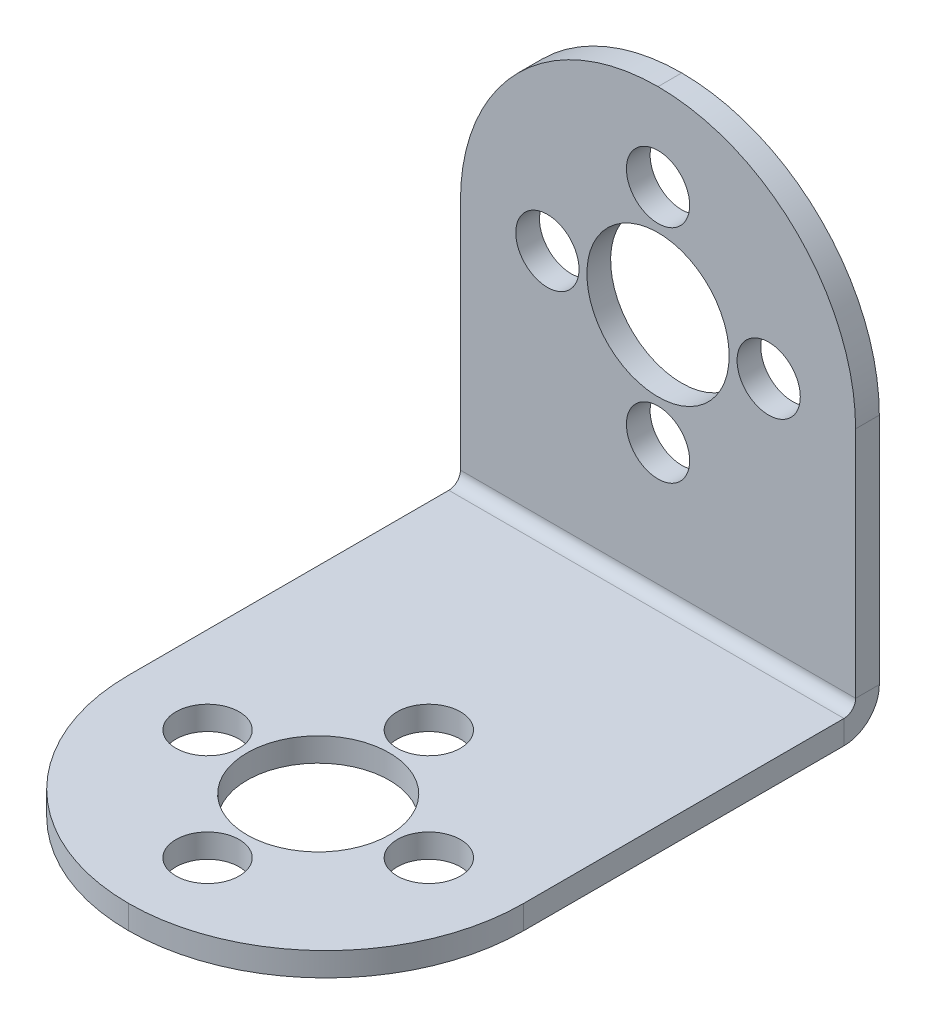
ISO-10303-21;
HEADER;
FILE_DESCRIPTION(('STEP AP214'),'2;1');
FILE_NAME('part.step','',(''),(''),'','','');
FILE_SCHEMA(('AUTOMOTIVE_DESIGN { 1 0 10303 214 1 1 1 1 }'));
ENDSEC;
DATA;
#1=APPLICATION_CONTEXT('core data for automotive mechanical design processes');
#2=APPLICATION_PROTOCOL_DEFINITION('international standard','automotive_design',2000,#1);
#3=PRODUCT_CONTEXT('',#1,'mechanical');
#4=PRODUCT('Part','Part','',(#3));
#5=PRODUCT_RELATED_PRODUCT_CATEGORY('part','',(#4));
#6=PRODUCT_DEFINITION_FORMATION('','',#4);
#7=PRODUCT_DEFINITION_CONTEXT('part definition',#1,'design');
#8=PRODUCT_DEFINITION('design','',#6,#7);
#9=PRODUCT_DEFINITION_SHAPE('','',#8);
#10=(LENGTH_UNIT() NAMED_UNIT(*) SI_UNIT(.MILLI.,.METRE.));
#11=(NAMED_UNIT(*) PLANE_ANGLE_UNIT() SI_UNIT($,.RADIAN.));
#12=(NAMED_UNIT(*) SI_UNIT($,.STERADIAN.) SOLID_ANGLE_UNIT());
#13=UNCERTAINTY_MEASURE_WITH_UNIT(LENGTH_MEASURE(1.E-05),#10,'distance_accuracy_value','');
#14=(GEOMETRIC_REPRESENTATION_CONTEXT(3) GLOBAL_UNCERTAINTY_ASSIGNED_CONTEXT((#13)) GLOBAL_UNIT_ASSIGNED_CONTEXT((#10,
#11,#12)) REPRESENTATION_CONTEXT('',''));
#15=CARTESIAN_POINT('',(0.,0.,0.));
#16=DIRECTION('',(0.,0.,1.));
#17=DIRECTION('',(1.,0.,0.));
#18=AXIS2_PLACEMENT_3D('',#15,#16,#17);
#19=CARTESIAN_POINT('',(0.,1.5,0.));
#20=DIRECTION('',(0.,1.,0.));
#21=DIRECTION('',(0.,0.,1.));
#22=AXIS2_PLACEMENT_3D('',#19,#20,#21);
#23=PLANE('',#22);
#24=CARTESIAN_POINT('',(7.,1.5,5.5));
#25=DIRECTION('',(0.,1.,0.));
#26=DIRECTION('',(0.,0.,1.));
#27=AXIS2_PLACEMENT_3D('',#24,#25,#26);
#28=CIRCLE('',#27,2.);
#29=CARTESIAN_POINT('',(7.,1.5,7.5));
#30=VERTEX_POINT('',#29);
#31=EDGE_CURVE('E203',#30,#30,#28,.T.);
#32=ORIENTED_EDGE('',*,*,#31,.F.);
#33=EDGE_LOOP('',(#32));
#34=FACE_BOUND('',#33,.T.);
#35=CARTESIAN_POINT('',(-7.,1.5,5.5));
#36=DIRECTION('',(0.,1.,0.));
#37=DIRECTION('',(0.,0.,1.));
#38=AXIS2_PLACEMENT_3D('',#35,#36,#37);
#39=CIRCLE('',#38,2.);
#40=CARTESIAN_POINT('',(-7.,1.5,7.5));
#41=VERTEX_POINT('',#40);
#42=EDGE_CURVE('E215',#41,#41,#39,.T.);
#43=ORIENTED_EDGE('',*,*,#42,.F.);
#44=EDGE_LOOP('',(#43));
#45=FACE_BOUND('',#44,.T.);
#46=CARTESIAN_POINT('',(0.,1.5,5.5));
#47=DIRECTION('',(0.,1.,0.));
#48=DIRECTION('',(0.,0.,1.));
#49=AXIS2_PLACEMENT_3D('',#46,#47,#48);
#50=CIRCLE('',#49,4.5);
#51=CARTESIAN_POINT('',(0.,1.5,10.));
#52=VERTEX_POINT('',#51);
#53=EDGE_CURVE('E221',#52,#52,#50,.T.);
#54=ORIENTED_EDGE('',*,*,#53,.F.);
#55=EDGE_LOOP('',(#54));
#56=FACE_BOUND('',#55,.T.);
#57=CARTESIAN_POINT('',(0.,1.5,12.5));
#58=DIRECTION('',(0.,1.,0.));
#59=DIRECTION('',(0.,0.,1.));
#60=AXIS2_PLACEMENT_3D('',#57,#58,#59);
#61=CIRCLE('',#60,2.);
#62=CARTESIAN_POINT('',(0.,1.5,14.5));
#63=VERTEX_POINT('',#62);
#64=EDGE_CURVE('E209',#63,#63,#61,.T.);
#65=ORIENTED_EDGE('',*,*,#64,.F.);
#66=EDGE_LOOP('',(#65));
#67=FACE_BOUND('',#66,.T.);
#68=CARTESIAN_POINT('',(0.,1.5,-1.5));
#69=DIRECTION('',(0.,1.,0.));
#70=DIRECTION('',(0.,0.,1.));
#71=AXIS2_PLACEMENT_3D('',#68,#69,#70);
#72=CIRCLE('',#71,2.);
#73=CARTESIAN_POINT('',(0.,1.5,0.500000000000001));
#74=VERTEX_POINT('',#73);
#75=EDGE_CURVE('E197',#74,#74,#72,.T.);
#76=ORIENTED_EDGE('',*,*,#75,.F.);
#77=EDGE_LOOP('',(#76));
#78=FACE_BOUND('',#77,.T.);
#79=CARTESIAN_POINT('',(0.,1.5,5.));
#80=DIRECTION('',(0.,1.,0.));
#81=DIRECTION('',(0.,0.,1.));
#82=AXIS2_PLACEMENT_3D('',#79,#80,#81);
#83=CIRCLE('',#82,12.5);
#84=CARTESIAN_POINT('',(-12.5,1.5,5.));
#85=VERTEX_POINT('',#84);
#86=CARTESIAN_POINT('',(0.,1.5,17.5));
#87=VERTEX_POINT('',#86);
#88=EDGE_CURVE('E243',#85,#87,#83,.T.);
#89=ORIENTED_EDGE('',*,*,#88,.T.);
#90=CARTESIAN_POINT('',(0.,1.5,5.));
#91=DIRECTION('',(0.,1.,0.));
#92=DIRECTION('',(0.,0.,1.));
#93=AXIS2_PLACEMENT_3D('',#90,#91,#92);
#94=CIRCLE('',#93,12.5);
#95=CARTESIAN_POINT('',(12.5,1.5,5.));
#96=VERTEX_POINT('',#95);
#97=EDGE_CURVE('E245',#87,#96,#94,.T.);
#98=ORIENTED_EDGE('',*,*,#97,.T.);
#99=DIRECTION('',(0.,0.,-1.));
#100=VECTOR('',#99,1.);
#101=CARTESIAN_POINT('',(12.5,1.5,-17.5));
#102=LINE('',#101,#100);
#103=CARTESIAN_POINT('',(12.5,1.5,-15.2634));
#104=VERTEX_POINT('',#103);
#105=EDGE_CURVE('E227',#96,#104,#102,.T.);
#106=ORIENTED_EDGE('',*,*,#105,.T.);
#107=DIRECTION('',(-1.,0.,0.));
#108=VECTOR('',#107,1.);
#109=CARTESIAN_POINT('',(-12.5,1.49999999999999,-15.2634));
#110=LINE('',#109,#108);
#111=CARTESIAN_POINT('',(-12.5,1.49999999999999,-15.2634));
#112=VERTEX_POINT('',#111);
#113=EDGE_CURVE('E169',#112,#104,#110,.F.);
#114=ORIENTED_EDGE('',*,*,#113,.F.);
#115=DIRECTION('',(0.,0.,1.));
#116=VECTOR('',#115,1.);
#117=CARTESIAN_POINT('',(-12.5,1.5,-17.5));
#118=LINE('',#117,#116);
#119=EDGE_CURVE('E229',#112,#85,#118,.T.);
#120=ORIENTED_EDGE('',*,*,#119,.T.);
#121=EDGE_LOOP('',(#89,#98,#106,#114,#120));
#122=FACE_BOUND('',#121,.T.);
#123=ADVANCED_FACE('F59',(#34,#45,#56,#67,#78,#122),#23,.T.);
#124=CARTESIAN_POINT('',(0.,0.,0.));
#125=DIRECTION('',(0.,1.,0.));
#126=DIRECTION('',(0.,0.,1.));
#127=AXIS2_PLACEMENT_3D('',#124,#125,#126);
#128=PLANE('',#127);
#129=CARTESIAN_POINT('',(0.,0.,-1.5));
#130=DIRECTION('',(0.,1.,0.));
#131=DIRECTION('',(0.,0.,1.));
#132=AXIS2_PLACEMENT_3D('',#129,#130,#131);
#133=CIRCLE('',#132,2.);
#134=CARTESIAN_POINT('',(0.,0.,0.500000000000001));
#135=VERTEX_POINT('',#134);
#136=EDGE_CURVE('E194',#135,#135,#133,.T.);
#137=ORIENTED_EDGE('',*,*,#136,.T.);
#138=EDGE_LOOP('',(#137));
#139=FACE_BOUND('',#138,.T.);
#140=CARTESIAN_POINT('',(7.,0.,5.5));
#141=DIRECTION('',(0.,1.,0.));
#142=DIRECTION('',(0.,0.,1.));
#143=AXIS2_PLACEMENT_3D('',#140,#141,#142);
#144=CIRCLE('',#143,2.);
#145=CARTESIAN_POINT('',(7.,0.,7.5));
#146=VERTEX_POINT('',#145);
#147=EDGE_CURVE('E200',#146,#146,#144,.T.);
#148=ORIENTED_EDGE('',*,*,#147,.T.);
#149=EDGE_LOOP('',(#148));
#150=FACE_BOUND('',#149,.T.);
#151=CARTESIAN_POINT('',(0.,0.,12.5));
#152=DIRECTION('',(0.,1.,0.));
#153=DIRECTION('',(0.,0.,1.));
#154=AXIS2_PLACEMENT_3D('',#151,#152,#153);
#155=CIRCLE('',#154,2.);
#156=CARTESIAN_POINT('',(0.,0.,14.5));
#157=VERTEX_POINT('',#156);
#158=EDGE_CURVE('E206',#157,#157,#155,.T.);
#159=ORIENTED_EDGE('',*,*,#158,.T.);
#160=EDGE_LOOP('',(#159));
#161=FACE_BOUND('',#160,.T.);
#162=CARTESIAN_POINT('',(-7.,0.,5.5));
#163=DIRECTION('',(0.,1.,0.));
#164=DIRECTION('',(0.,0.,1.));
#165=AXIS2_PLACEMENT_3D('',#162,#163,#164);
#166=CIRCLE('',#165,2.);
#167=CARTESIAN_POINT('',(-7.,0.,7.5));
#168=VERTEX_POINT('',#167);
#169=EDGE_CURVE('E212',#168,#168,#166,.T.);
#170=ORIENTED_EDGE('',*,*,#169,.T.);
#171=EDGE_LOOP('',(#170));
#172=FACE_BOUND('',#171,.T.);
#173=CARTESIAN_POINT('',(0.,0.,5.5));
#174=DIRECTION('',(0.,1.,0.));
#175=DIRECTION('',(0.,0.,1.));
#176=AXIS2_PLACEMENT_3D('',#173,#174,#175);
#177=CIRCLE('',#176,4.5);
#178=CARTESIAN_POINT('',(0.,0.,10.));
#179=VERTEX_POINT('',#178);
#180=EDGE_CURVE('E218',#179,#179,#177,.T.);
#181=ORIENTED_EDGE('',*,*,#180,.T.);
#182=EDGE_LOOP('',(#181));
#183=FACE_BOUND('',#182,.T.);
#184=DIRECTION('',(0.,0.,-1.));
#185=VECTOR('',#184,1.);
#186=CARTESIAN_POINT('',(12.5,0.,-17.5));
#187=LINE('',#186,#185);
#188=CARTESIAN_POINT('',(12.5,0.,5.));
#189=VERTEX_POINT('',#188);
#190=CARTESIAN_POINT('',(12.5,0.,-15.2634));
#191=VERTEX_POINT('',#190);
#192=EDGE_CURVE('E224',#189,#191,#187,.T.);
#193=ORIENTED_EDGE('',*,*,#192,.F.);
#194=CARTESIAN_POINT('',(0.,0.,5.));
#195=DIRECTION('',(0.,1.,0.));
#196=DIRECTION('',(0.,0.,1.));
#197=AXIS2_PLACEMENT_3D('',#194,#195,#196);
#198=CIRCLE('',#197,12.5);
#199=CARTESIAN_POINT('',(0.,0.,17.5));
#200=VERTEX_POINT('',#199);
#201=EDGE_CURVE('E241',#189,#200,#198,.F.);
#202=ORIENTED_EDGE('',*,*,#201,.T.);
#203=CARTESIAN_POINT('',(0.,0.,5.));
#204=DIRECTION('',(0.,1.,0.));
#205=DIRECTION('',(0.,0.,1.));
#206=AXIS2_PLACEMENT_3D('',#203,#204,#205);
#207=CIRCLE('',#206,12.5);
#208=CARTESIAN_POINT('',(-12.5,0.,5.));
#209=VERTEX_POINT('',#208);
#210=EDGE_CURVE('E239',#200,#209,#207,.F.);
#211=ORIENTED_EDGE('',*,*,#210,.T.);
#212=DIRECTION('',(0.,0.,1.));
#213=VECTOR('',#212,1.);
#214=CARTESIAN_POINT('',(-12.5,0.,-17.5));
#215=LINE('',#214,#213);
#216=CARTESIAN_POINT('',(-12.5,0.,-15.2634));
#217=VERTEX_POINT('',#216);
#218=EDGE_CURVE('E230',#217,#209,#215,.T.);
#219=ORIENTED_EDGE('',*,*,#218,.F.);
#220=DIRECTION('',(-1.,0.,0.));
#221=VECTOR('',#220,1.);
#222=CARTESIAN_POINT('',(-12.5,0.,-15.2634));
#223=LINE('',#222,#221);
#224=EDGE_CURVE('E147',#217,#191,#223,.F.);
#225=ORIENTED_EDGE('',*,*,#224,.T.);
#226=EDGE_LOOP('',(#193,#202,#211,#219,#225));
#227=FACE_BOUND('',#226,.T.);
#228=ADVANCED_FACE('F302',(#139,#150,#161,#172,#183,#227),#128,.F.);
#229=CARTESIAN_POINT('',(12.5,1.5,-17.5));
#230=DIRECTION('',(-1.,0.,0.));
#231=DIRECTION('',(0.,0.,1.));
#232=AXIS2_PLACEMENT_3D('',#229,#230,#231);
#233=PLANE('',#232);
#234=ORIENTED_EDGE('',*,*,#105,.F.);
#235=DIRECTION('',(0.,-1.,0.));
#236=VECTOR('',#235,1.);
#237=CARTESIAN_POINT('',(12.5,1.5,5.));
#238=LINE('',#237,#236);
#239=EDGE_CURVE('E233',#96,#189,#238,.T.);
#240=ORIENTED_EDGE('',*,*,#239,.T.);
#241=ORIENTED_EDGE('',*,*,#192,.T.);
#242=DIRECTION('',(0.,-1.,0.));
#243=VECTOR('',#242,1.);
#244=CARTESIAN_POINT('',(12.5,1.49999999999999,-15.2634));
#245=LINE('',#244,#243);
#246=EDGE_CURVE('E191',#104,#191,#245,.T.);
#247=ORIENTED_EDGE('',*,*,#246,.F.);
#248=EDGE_LOOP('',(#234,#240,#241,#247));
#249=FACE_BOUND('',#248,.T.);
#250=ADVANCED_FACE('F298',(#249),#233,.F.);
#251=CARTESIAN_POINT('',(-12.5,1.5,-17.5));
#252=DIRECTION('',(1.,0.,0.));
#253=DIRECTION('',(0.,0.,-1.));
#254=AXIS2_PLACEMENT_3D('',#251,#252,#253);
#255=PLANE('',#254);
#256=ORIENTED_EDGE('',*,*,#218,.T.);
#257=DIRECTION('',(0.,-1.,0.));
#258=VECTOR('',#257,1.);
#259=CARTESIAN_POINT('',(-12.5,1.5,5.));
#260=LINE('',#259,#258);
#261=EDGE_CURVE('E247',#209,#85,#260,.F.);
#262=ORIENTED_EDGE('',*,*,#261,.T.);
#263=ORIENTED_EDGE('',*,*,#119,.F.);
#264=DIRECTION('',(0.,-1.,0.));
#265=VECTOR('',#264,1.);
#266=CARTESIAN_POINT('',(-12.5,1.49999999999999,-15.2634));
#267=LINE('',#266,#265);
#268=EDGE_CURVE('E185',#112,#217,#267,.T.);
#269=ORIENTED_EDGE('',*,*,#268,.T.);
#270=EDGE_LOOP('',(#256,#262,#263,#269));
#271=FACE_BOUND('',#270,.T.);
#272=ADVANCED_FACE('F291',(#271),#255,.F.);
#273=CARTESIAN_POINT('',(0.,1.5,5.5));
#274=DIRECTION('',(0.,-1.,0.));
#275=DIRECTION('',(0.,0.,-1.));
#276=AXIS2_PLACEMENT_3D('',#273,#274,#275);
#277=CYLINDRICAL_SURFACE('',#276,4.5);
#278=ORIENTED_EDGE('',*,*,#53,.T.);
#279=EDGE_LOOP('',(#278));
#280=FACE_BOUND('',#279,.T.);
#281=ORIENTED_EDGE('',*,*,#180,.F.);
#282=EDGE_LOOP('',(#281));
#283=FACE_BOUND('',#282,.T.);
#284=ADVANCED_FACE('F317',(#280,#283),#277,.F.);
#285=CARTESIAN_POINT('',(-7.,1.5,5.5));
#286=DIRECTION('',(0.,-1.,0.));
#287=DIRECTION('',(0.,0.,-1.));
#288=AXIS2_PLACEMENT_3D('',#285,#286,#287);
#289=CYLINDRICAL_SURFACE('',#288,2.);
#290=ORIENTED_EDGE('',*,*,#42,.T.);
#291=EDGE_LOOP('',(#290));
#292=FACE_BOUND('',#291,.T.);
#293=ORIENTED_EDGE('',*,*,#169,.F.);
#294=EDGE_LOOP('',(#293));
#295=FACE_BOUND('',#294,.T.);
#296=ADVANCED_FACE('F451',(#292,#295),#289,.F.);
#297=CARTESIAN_POINT('',(0.,1.5,12.5));
#298=DIRECTION('',(0.,-1.,0.));
#299=DIRECTION('',(0.,0.,-1.));
#300=AXIS2_PLACEMENT_3D('',#297,#298,#299);
#301=CYLINDRICAL_SURFACE('',#300,2.);
#302=ORIENTED_EDGE('',*,*,#64,.T.);
#303=EDGE_LOOP('',(#302));
#304=FACE_BOUND('',#303,.T.);
#305=ORIENTED_EDGE('',*,*,#158,.F.);
#306=EDGE_LOOP('',(#305));
#307=FACE_BOUND('',#306,.T.);
#308=ADVANCED_FACE('F443',(#304,#307),#301,.F.);
#309=CARTESIAN_POINT('',(7.,1.5,5.5));
#310=DIRECTION('',(0.,-1.,0.));
#311=DIRECTION('',(0.,0.,-1.));
#312=AXIS2_PLACEMENT_3D('',#309,#310,#311);
#313=CYLINDRICAL_SURFACE('',#312,2.);
#314=ORIENTED_EDGE('',*,*,#31,.T.);
#315=EDGE_LOOP('',(#314));
#316=FACE_BOUND('',#315,.T.);
#317=ORIENTED_EDGE('',*,*,#147,.F.);
#318=EDGE_LOOP('',(#317));
#319=FACE_BOUND('',#318,.T.);
#320=ADVANCED_FACE('F435',(#316,#319),#313,.F.);
#321=CARTESIAN_POINT('',(0.,1.5,-1.5));
#322=DIRECTION('',(0.,-1.,0.));
#323=DIRECTION('',(0.,0.,-1.));
#324=AXIS2_PLACEMENT_3D('',#321,#322,#323);
#325=CYLINDRICAL_SURFACE('',#324,2.);
#326=ORIENTED_EDGE('',*,*,#75,.T.);
#327=EDGE_LOOP('',(#326));
#328=FACE_BOUND('',#327,.T.);
#329=ORIENTED_EDGE('',*,*,#136,.F.);
#330=EDGE_LOOP('',(#329));
#331=FACE_BOUND('',#330,.T.);
#332=ADVANCED_FACE('F428',(#328,#331),#325,.F.);
#333=CARTESIAN_POINT('',(12.5,2.23659999999999,-15.2634));
#334=DIRECTION('',(1.,0.,0.));
#335=DIRECTION('',(0.,0.,-1.));
#336=AXIS2_PLACEMENT_3D('',#333,#334,#335);
#337=PLANE('',#336);
#338=DIRECTION('',(0.,0.,1.));
#339=VECTOR('',#338,1.);
#340=CARTESIAN_POINT('',(12.5,2.23660000000001,-17.5));
#341=LINE('',#340,#339);
#342=CARTESIAN_POINT('',(12.5,2.23659999999999,-16.));
#343=VERTEX_POINT('',#342);
#344=CARTESIAN_POINT('',(12.5,2.23659999999999,-17.5));
#345=VERTEX_POINT('',#344);
#346=EDGE_CURVE('E180',#343,#345,#341,.F.);
#347=ORIENTED_EDGE('',*,*,#346,.F.);
#348=CARTESIAN_POINT('',(12.5,2.23659999999999,-15.2634));
#349=DIRECTION('',(-1.,0.,0.));
#350=DIRECTION('',(0.,0.,1.));
#351=AXIS2_PLACEMENT_3D('',#348,#349,#350);
#352=CIRCLE('',#351,0.7366);
#353=EDGE_CURVE('E150',#104,#343,#352,.F.);
#354=ORIENTED_EDGE('',*,*,#353,.F.);
#355=ORIENTED_EDGE('',*,*,#246,.T.);
#356=CARTESIAN_POINT('',(12.5,2.23659999999999,-15.2634));
#357=DIRECTION('',(-1.,0.,0.));
#358=DIRECTION('',(0.,0.,1.));
#359=AXIS2_PLACEMENT_3D('',#356,#357,#358);
#360=CIRCLE('',#359,2.2366);
#361=EDGE_CURVE('E184',#191,#345,#360,.F.);
#362=ORIENTED_EDGE('',*,*,#361,.T.);
#363=EDGE_LOOP('',(#347,#354,#355,#362));
#364=FACE_BOUND('',#363,.T.);
#365=ADVANCED_FACE('F282',(#364),#337,.T.);
#366=CARTESIAN_POINT('',(-12.5,2.23659999999999,-15.2634));
#367=DIRECTION('',(1.,0.,0.));
#368=DIRECTION('',(0.,0.,-1.));
#369=AXIS2_PLACEMENT_3D('',#366,#367,#368);
#370=PLANE('',#369);
#371=CARTESIAN_POINT('',(-12.5,2.23659999999999,-15.2634));
#372=DIRECTION('',(-1.,0.,0.));
#373=DIRECTION('',(0.,0.,1.));
#374=AXIS2_PLACEMENT_3D('',#371,#372,#373);
#375=CIRCLE('',#374,0.7366);
#376=CARTESIAN_POINT('',(-12.5,2.23659999999999,-16.));
#377=VERTEX_POINT('',#376);
#378=EDGE_CURVE('E157',#377,#112,#375,.T.);
#379=ORIENTED_EDGE('',*,*,#378,.F.);
#380=DIRECTION('',(0.,0.,1.));
#381=VECTOR('',#380,1.);
#382=CARTESIAN_POINT('',(-12.5,2.2366,-16.));
#383=LINE('',#382,#381);
#384=CARTESIAN_POINT('',(-12.5,2.23660000000001,-17.5));
#385=VERTEX_POINT('',#384);
#386=EDGE_CURVE('E154',#377,#385,#383,.F.);
#387=ORIENTED_EDGE('',*,*,#386,.T.);
#388=CARTESIAN_POINT('',(-12.5,2.23659999999999,-15.2634));
#389=DIRECTION('',(-1.,0.,0.));
#390=DIRECTION('',(0.,0.,1.));
#391=AXIS2_PLACEMENT_3D('',#388,#389,#390);
#392=CIRCLE('',#391,2.2366);
#393=EDGE_CURVE('E139',#385,#217,#392,.T.);
#394=ORIENTED_EDGE('',*,*,#393,.T.);
#395=ORIENTED_EDGE('',*,*,#268,.F.);
#396=EDGE_LOOP('',(#379,#387,#394,#395));
#397=FACE_BOUND('',#396,.T.);
#398=ADVANCED_FACE('F155',(#397),#370,.F.);
#399=CARTESIAN_POINT('',(-12.5,2.23659999999999,-15.2634));
#400=DIRECTION('',(-1.,0.,0.));
#401=DIRECTION('',(0.,0.,-1.));
#402=AXIS2_PLACEMENT_3D('',#399,#400,#401);
#403=CYLINDRICAL_SURFACE('',#402,2.2366);
#404=ORIENTED_EDGE('',*,*,#224,.F.);
#405=ORIENTED_EDGE('',*,*,#393,.F.);
#406=DIRECTION('',(-1.,0.,0.));
#407=VECTOR('',#406,1.);
#408=CARTESIAN_POINT('',(12.5,2.23660000000001,-17.5));
#409=LINE('',#408,#407);
#410=EDGE_CURVE('E144',#385,#345,#409,.F.);
#411=ORIENTED_EDGE('',*,*,#410,.T.);
#412=ORIENTED_EDGE('',*,*,#361,.F.);
#413=EDGE_LOOP('',(#404,#405,#411,#412));
#414=FACE_BOUND('',#413,.T.);
#415=ADVANCED_FACE('F141',(#414),#403,.T.);
#416=CARTESIAN_POINT('',(-12.5,2.23659999999999,-15.2634));
#417=DIRECTION('',(-1.,0.,0.));
#418=DIRECTION('',(0.,0.,-1.));
#419=AXIS2_PLACEMENT_3D('',#416,#417,#418);
#420=CYLINDRICAL_SURFACE('',#419,0.7366);
#421=ORIENTED_EDGE('',*,*,#113,.T.);
#422=ORIENTED_EDGE('',*,*,#353,.T.);
#423=DIRECTION('',(-1.,0.,0.));
#424=VECTOR('',#423,1.);
#425=CARTESIAN_POINT('',(12.5,2.2366,-16.));
#426=LINE('',#425,#424);
#427=EDGE_CURVE('E159',#343,#377,#426,.T.);
#428=ORIENTED_EDGE('',*,*,#427,.T.);
#429=ORIENTED_EDGE('',*,*,#378,.T.);
#430=EDGE_LOOP('',(#421,#422,#428,#429));
#431=FACE_BOUND('',#430,.T.);
#432=ADVANCED_FACE('F284',(#431),#420,.F.);
#433=CARTESIAN_POINT('',(12.5,1.49999999999999,-17.5));
#434=DIRECTION('',(-1.,0.,0.));
#435=DIRECTION('',(0.,0.,1.));
#436=AXIS2_PLACEMENT_3D('',#433,#434,#435);
#437=PLANE('',#436);
#438=DIRECTION('',(0.,-1.,0.));
#439=VECTOR('',#438,1.);
#440=CARTESIAN_POINT('',(12.5,0.,-17.5));
#441=LINE('',#440,#439);
#442=CARTESIAN_POINT('',(12.5,17.,-17.5000000000001));
#443=VERTEX_POINT('',#442);
#444=EDGE_CURVE('E164',#443,#345,#441,.T.);
#445=ORIENTED_EDGE('',*,*,#444,.F.);
#446=DIRECTION('',(0.,0.,1.));
#447=VECTOR('',#446,1.);
#448=CARTESIAN_POINT('',(12.5,17.,-17.5000000000001));
#449=LINE('',#448,#447);
#450=CARTESIAN_POINT('',(12.5,17.,-16.0000000000001));
#451=VERTEX_POINT('',#450);
#452=EDGE_CURVE('E249',#443,#451,#449,.T.);
#453=ORIENTED_EDGE('',*,*,#452,.T.);
#454=DIRECTION('',(0.,1.,0.));
#455=VECTOR('',#454,1.);
#456=CARTESIAN_POINT('',(12.5,1.5,-16.));
#457=LINE('',#456,#455);
#458=EDGE_CURVE('E165',#451,#343,#457,.F.);
#459=ORIENTED_EDGE('',*,*,#458,.T.);
#460=ORIENTED_EDGE('',*,*,#346,.T.);
#461=EDGE_LOOP('',(#445,#453,#459,#460));
#462=FACE_BOUND('',#461,.T.);
#463=ADVANCED_FACE('F279',(#462),#437,.F.);
#464=CARTESIAN_POINT('',(-12.5,29.5,-17.5000000000001));
#465=DIRECTION('',(1.,0.,0.));
#466=DIRECTION('',(0.,1.,0.));
#467=AXIS2_PLACEMENT_3D('',#464,#465,#466);
#468=PLANE('',#467);
#469=DIRECTION('',(0.,-1.,0.));
#470=VECTOR('',#469,1.);
#471=CARTESIAN_POINT('',(-12.5,29.5,-16.0000000000001));
#472=LINE('',#471,#470);
#473=CARTESIAN_POINT('',(-12.5,17.,-16.0000000000001));
#474=VERTEX_POINT('',#473);
#475=EDGE_CURVE('E171',#377,#474,#472,.F.);
#476=ORIENTED_EDGE('',*,*,#475,.T.);
#477=DIRECTION('',(0.,0.,1.));
#478=VECTOR('',#477,1.);
#479=CARTESIAN_POINT('',(-12.5,17.,-17.5000000000001));
#480=LINE('',#479,#478);
#481=CARTESIAN_POINT('',(-12.5,17.,-17.5000000000001));
#482=VERTEX_POINT('',#481);
#483=EDGE_CURVE('E13',#474,#482,#480,.F.);
#484=ORIENTED_EDGE('',*,*,#483,.T.);
#485=DIRECTION('',(0.,1.,0.));
#486=VECTOR('',#485,1.);
#487=CARTESIAN_POINT('',(-12.5,0.,-17.5));
#488=LINE('',#487,#486);
#489=EDGE_CURVE('E162',#385,#482,#488,.T.);
#490=ORIENTED_EDGE('',*,*,#489,.F.);
#491=ORIENTED_EDGE('',*,*,#386,.F.);
#492=EDGE_LOOP('',(#476,#484,#490,#491));
#493=FACE_BOUND('',#492,.T.);
#494=ADVANCED_FACE('F167',(#493),#468,.F.);
#495=CARTESIAN_POINT('',(0.,0.,-17.5));
#496=DIRECTION('',(0.,0.,1.));
#497=DIRECTION('',(0.,-1.,0.));
#498=AXIS2_PLACEMENT_3D('',#495,#496,#497);
#499=PLANE('',#498);
#500=CARTESIAN_POINT('',(-7.,17.,-17.5000000000001));
#501=DIRECTION('',(0.,0.,1.));
#502=DIRECTION('',(0.,-1.,0.));
#503=AXIS2_PLACEMENT_3D('',#500,#501,#502);
#504=CIRCLE('',#503,2.);
#505=CARTESIAN_POINT('',(-7.,15.,-17.5));
#506=VERTEX_POINT('',#505);
#507=EDGE_CURVE('E174',#506,#506,#504,.T.);
#508=ORIENTED_EDGE('',*,*,#507,.T.);
#509=EDGE_LOOP('',(#508));
#510=FACE_BOUND('',#509,.T.);
#511=CARTESIAN_POINT('',(7.,17.,-17.5000000000001));
#512=DIRECTION('',(0.,0.,1.));
#513=DIRECTION('',(0.,-1.,0.));
#514=AXIS2_PLACEMENT_3D('',#511,#512,#513);
#515=CIRCLE('',#514,2.);
#516=CARTESIAN_POINT('',(7.,15.,-17.5));
#517=VERTEX_POINT('',#516);
#518=EDGE_CURVE('E606',#517,#517,#515,.T.);
#519=ORIENTED_EDGE('',*,*,#518,.T.);
#520=EDGE_LOOP('',(#519));
#521=FACE_BOUND('',#520,.T.);
#522=CARTESIAN_POINT('',(0.,24.,-17.5000000000001));
#523=DIRECTION('',(0.,0.,1.));
#524=DIRECTION('',(0.,-1.,0.));
#525=AXIS2_PLACEMENT_3D('',#522,#523,#524);
#526=CIRCLE('',#525,2.);
#527=CARTESIAN_POINT('',(0.,22.,-17.5000000000001));
#528=VERTEX_POINT('',#527);
#529=EDGE_CURVE('E610',#528,#528,#526,.T.);
#530=ORIENTED_EDGE('',*,*,#529,.T.);
#531=EDGE_LOOP('',(#530));
#532=FACE_BOUND('',#531,.T.);
#533=CARTESIAN_POINT('',(0.,10.,-17.5));
#534=DIRECTION('',(0.,0.,1.));
#535=DIRECTION('',(0.,-1.,0.));
#536=AXIS2_PLACEMENT_3D('',#533,#534,#535);
#537=CIRCLE('',#536,2.);
#538=CARTESIAN_POINT('',(0.,8.,-17.5));
#539=VERTEX_POINT('',#538);
#540=EDGE_CURVE('E614',#539,#539,#537,.T.);
#541=ORIENTED_EDGE('',*,*,#540,.T.);
#542=EDGE_LOOP('',(#541));
#543=FACE_BOUND('',#542,.T.);
#544=CARTESIAN_POINT('',(0.,17.,-17.5000000000001));
#545=DIRECTION('',(0.,0.,1.));
#546=DIRECTION('',(0.,-1.,0.));
#547=AXIS2_PLACEMENT_3D('',#544,#545,#546);
#548=CIRCLE('',#547,4.5);
#549=CARTESIAN_POINT('',(0.,12.5,-17.5));
#550=VERTEX_POINT('',#549);
#551=EDGE_CURVE('E617',#550,#550,#548,.T.);
#552=ORIENTED_EDGE('',*,*,#551,.T.);
#553=EDGE_LOOP('',(#552));
#554=FACE_BOUND('',#553,.T.);
#555=CARTESIAN_POINT('',(0.,17.,-17.5000000000001));
#556=DIRECTION('',(0.,0.,1.));
#557=DIRECTION('',(0.,-1.,0.));
#558=AXIS2_PLACEMENT_3D('',#555,#556,#557);
#559=CIRCLE('',#558,12.5);
#560=CARTESIAN_POINT('',(0.,29.5,-17.5000000000001));
#561=VERTEX_POINT('',#560);
#562=EDGE_CURVE('E76',#482,#561,#559,.F.);
#563=ORIENTED_EDGE('',*,*,#562,.T.);
#564=CARTESIAN_POINT('',(0.,17.,-17.5000000000001));
#565=DIRECTION('',(0.,0.,1.));
#566=DIRECTION('',(0.,-1.,0.));
#567=AXIS2_PLACEMENT_3D('',#564,#565,#566);
#568=CIRCLE('',#567,12.5);
#569=EDGE_CURVE('E68',#561,#443,#568,.F.);
#570=ORIENTED_EDGE('',*,*,#569,.T.);
#571=ORIENTED_EDGE('',*,*,#444,.T.);
#572=ORIENTED_EDGE('',*,*,#410,.F.);
#573=ORIENTED_EDGE('',*,*,#489,.T.);
#574=EDGE_LOOP('',(#563,#570,#571,#572,#573));
#575=FACE_BOUND('',#574,.T.);
#576=ADVANCED_FACE('F161',(#510,#521,#532,#543,#554,#575),#499,.F.);
#577=CARTESIAN_POINT('',(0.,0.,-16.));
#578=DIRECTION('',(0.,0.,1.));
#579=DIRECTION('',(0.,-1.,0.));
#580=AXIS2_PLACEMENT_3D('',#577,#578,#579);
#581=PLANE('',#580);
#582=CARTESIAN_POINT('',(-7.,17.,-16.));
#583=DIRECTION('',(0.,0.,1.));
#584=DIRECTION('',(1.,0.,0.));
#585=AXIS2_PLACEMENT_3D('',#582,#583,#584);
#586=CIRCLE('',#585,2.);
#587=CARTESIAN_POINT('',(-5.,17.,-16.));
#588=VERTEX_POINT('',#587);
#589=EDGE_CURVE('E623',#588,#588,#586,.T.);
#590=ORIENTED_EDGE('',*,*,#589,.F.);
#591=EDGE_LOOP('',(#590));
#592=FACE_BOUND('',#591,.T.);
#593=CARTESIAN_POINT('',(7.,17.,-16.));
#594=DIRECTION('',(0.,0.,1.));
#595=DIRECTION('',(1.,0.,0.));
#596=AXIS2_PLACEMENT_3D('',#593,#594,#595);
#597=CIRCLE('',#596,2.);
#598=CARTESIAN_POINT('',(9.,17.,-16.));
#599=VERTEX_POINT('',#598);
#600=EDGE_CURVE('E627',#599,#599,#597,.T.);
#601=ORIENTED_EDGE('',*,*,#600,.F.);
#602=EDGE_LOOP('',(#601));
#603=FACE_BOUND('',#602,.T.);
#604=CARTESIAN_POINT('',(0.,24.,-16.));
#605=DIRECTION('',(0.,0.,1.));
#606=DIRECTION('',(1.,0.,0.));
#607=AXIS2_PLACEMENT_3D('',#604,#605,#606);
#608=CIRCLE('',#607,2.);
#609=CARTESIAN_POINT('',(2.,24.,-16.));
#610=VERTEX_POINT('',#609);
#611=EDGE_CURVE('E264',#610,#610,#608,.T.);
#612=ORIENTED_EDGE('',*,*,#611,.F.);
#613=EDGE_LOOP('',(#612));
#614=FACE_BOUND('',#613,.T.);
#615=CARTESIAN_POINT('',(0.,10.,-16.));
#616=DIRECTION('',(0.,0.,1.));
#617=DIRECTION('',(1.,0.,0.));
#618=AXIS2_PLACEMENT_3D('',#615,#616,#617);
#619=CIRCLE('',#618,2.);
#620=CARTESIAN_POINT('',(2.,10.,-16.));
#621=VERTEX_POINT('',#620);
#622=EDGE_CURVE('E259',#621,#621,#619,.T.);
#623=ORIENTED_EDGE('',*,*,#622,.F.);
#624=EDGE_LOOP('',(#623));
#625=FACE_BOUND('',#624,.T.);
#626=CARTESIAN_POINT('',(0.,17.,-16.));
#627=DIRECTION('',(0.,0.,1.));
#628=DIRECTION('',(1.,0.,0.));
#629=AXIS2_PLACEMENT_3D('',#626,#627,#628);
#630=CIRCLE('',#629,4.5);
#631=CARTESIAN_POINT('',(4.5,17.,-16.));
#632=VERTEX_POINT('',#631);
#633=EDGE_CURVE('E619',#632,#632,#630,.T.);
#634=ORIENTED_EDGE('',*,*,#633,.F.);
#635=EDGE_LOOP('',(#634));
#636=FACE_BOUND('',#635,.T.);
#637=ORIENTED_EDGE('',*,*,#458,.F.);
#638=CARTESIAN_POINT('',(0.,17.,-16.0000000000001));
#639=DIRECTION('',(0.,0.,1.));
#640=DIRECTION('',(0.,-1.,0.));
#641=AXIS2_PLACEMENT_3D('',#638,#639,#640);
#642=CIRCLE('',#641,12.5);
#643=CARTESIAN_POINT('',(0.,29.5,-16.0000000000001));
#644=VERTEX_POINT('',#643);
#645=EDGE_CURVE('E254',#451,#644,#642,.T.);
#646=ORIENTED_EDGE('',*,*,#645,.T.);
#647=CARTESIAN_POINT('',(0.,17.,-16.0000000000001));
#648=DIRECTION('',(0.,0.,1.));
#649=DIRECTION('',(0.,-1.,0.));
#650=AXIS2_PLACEMENT_3D('',#647,#648,#649);
#651=CIRCLE('',#650,12.5);
#652=EDGE_CURVE('E252',#644,#474,#651,.T.);
#653=ORIENTED_EDGE('',*,*,#652,.T.);
#654=ORIENTED_EDGE('',*,*,#475,.F.);
#655=ORIENTED_EDGE('',*,*,#427,.F.);
#656=EDGE_LOOP('',(#637,#646,#653,#654,#655));
#657=FACE_BOUND('',#656,.T.);
#658=ADVANCED_FACE('F275',(#592,#603,#614,#625,#636,#657),#581,.T.);
#659=CARTESIAN_POINT('',(0.,17.,-26.));
#660=DIRECTION('',(0.,0.,1.));
#661=DIRECTION('',(1.,0.,0.));
#662=AXIS2_PLACEMENT_3D('',#659,#660,#661);
#663=CYLINDRICAL_SURFACE('',#662,4.5);
#664=ORIENTED_EDGE('',*,*,#633,.T.);
#665=EDGE_LOOP('',(#664));
#666=FACE_BOUND('',#665,.T.);
#667=ORIENTED_EDGE('',*,*,#551,.F.);
#668=EDGE_LOOP('',(#667));
#669=FACE_BOUND('',#668,.T.);
#670=ADVANCED_FACE('F369',(#666,#669),#663,.F.);
#671=CARTESIAN_POINT('',(0.,10.,-26.));
#672=DIRECTION('',(0.,0.,1.));
#673=DIRECTION('',(1.,0.,0.));
#674=AXIS2_PLACEMENT_3D('',#671,#672,#673);
#675=CYLINDRICAL_SURFACE('',#674,2.);
#676=ORIENTED_EDGE('',*,*,#622,.T.);
#677=EDGE_LOOP('',(#676));
#678=FACE_BOUND('',#677,.T.);
#679=ORIENTED_EDGE('',*,*,#540,.F.);
#680=EDGE_LOOP('',(#679));
#681=FACE_BOUND('',#680,.T.);
#682=ADVANCED_FACE('F361',(#678,#681),#675,.F.);
#683=CARTESIAN_POINT('',(0.,24.,-26.));
#684=DIRECTION('',(0.,0.,1.));
#685=DIRECTION('',(1.,0.,0.));
#686=AXIS2_PLACEMENT_3D('',#683,#684,#685);
#687=CYLINDRICAL_SURFACE('',#686,2.);
#688=ORIENTED_EDGE('',*,*,#611,.T.);
#689=EDGE_LOOP('',(#688));
#690=FACE_BOUND('',#689,.T.);
#691=ORIENTED_EDGE('',*,*,#529,.F.);
#692=EDGE_LOOP('',(#691));
#693=FACE_BOUND('',#692,.T.);
#694=ADVANCED_FACE('F353',(#690,#693),#687,.F.);
#695=CARTESIAN_POINT('',(7.,17.,-26.));
#696=DIRECTION('',(0.,0.,1.));
#697=DIRECTION('',(1.,0.,0.));
#698=AXIS2_PLACEMENT_3D('',#695,#696,#697);
#699=CYLINDRICAL_SURFACE('',#698,2.);
#700=ORIENTED_EDGE('',*,*,#600,.T.);
#701=EDGE_LOOP('',(#700));
#702=FACE_BOUND('',#701,.T.);
#703=ORIENTED_EDGE('',*,*,#518,.F.);
#704=EDGE_LOOP('',(#703));
#705=FACE_BOUND('',#704,.T.);
#706=ADVANCED_FACE('F344',(#702,#705),#699,.F.);
#707=CARTESIAN_POINT('',(-7.,17.,-26.));
#708=DIRECTION('',(0.,0.,1.));
#709=DIRECTION('',(1.,0.,0.));
#710=AXIS2_PLACEMENT_3D('',#707,#708,#709);
#711=CYLINDRICAL_SURFACE('',#710,2.);
#712=ORIENTED_EDGE('',*,*,#589,.T.);
#713=EDGE_LOOP('',(#712));
#714=FACE_BOUND('',#713,.T.);
#715=ORIENTED_EDGE('',*,*,#507,.F.);
#716=EDGE_LOOP('',(#715));
#717=FACE_BOUND('',#716,.T.);
#718=ADVANCED_FACE('F322',(#714,#717),#711,.F.);
#719=CARTESIAN_POINT('',(0.,1.5,5.));
#720=DIRECTION('',(0.,-1.,0.));
#721=DIRECTION('',(0.,0.,-1.));
#722=AXIS2_PLACEMENT_3D('',#719,#720,#721);
#723=CYLINDRICAL_SURFACE('',#722,12.5);
#724=DIRECTION('',(0.,-1.,0.));
#725=VECTOR('',#724,1.);
#726=CARTESIAN_POINT('',(0.,1.5,17.5));
#727=LINE('',#726,#725);
#728=EDGE_CURVE('E257',#87,#200,#727,.T.);
#729=ORIENTED_EDGE('',*,*,#728,.F.);
#730=ORIENTED_EDGE('',*,*,#88,.F.);
#731=ORIENTED_EDGE('',*,*,#261,.F.);
#732=ORIENTED_EDGE('',*,*,#210,.F.);
#733=EDGE_LOOP('',(#729,#730,#731,#732));
#734=FACE_BOUND('',#733,.T.);
#735=ADVANCED_FACE('F295',(#734),#723,.T.);
#736=CARTESIAN_POINT('',(0.,1.5,5.));
#737=DIRECTION('',(0.,-1.,0.));
#738=DIRECTION('',(0.,0.,-1.));
#739=AXIS2_PLACEMENT_3D('',#736,#737,#738);
#740=CYLINDRICAL_SURFACE('',#739,12.5);
#741=ORIENTED_EDGE('',*,*,#97,.F.);
#742=ORIENTED_EDGE('',*,*,#728,.T.);
#743=ORIENTED_EDGE('',*,*,#201,.F.);
#744=ORIENTED_EDGE('',*,*,#239,.F.);
#745=EDGE_LOOP('',(#741,#742,#743,#744));
#746=FACE_BOUND('',#745,.T.);
#747=ADVANCED_FACE('F300',(#746),#740,.T.);
#748=CARTESIAN_POINT('',(0.,17.,-17.5000000000001));
#749=DIRECTION('',(0.,0.,1.));
#750=DIRECTION('',(0.,-1.,0.));
#751=AXIS2_PLACEMENT_3D('',#748,#749,#750);
#752=CYLINDRICAL_SURFACE('',#751,12.5);
#753=DIRECTION('',(0.,0.,1.));
#754=VECTOR('',#753,1.);
#755=CARTESIAN_POINT('',(0.,29.5,-17.5000000000001));
#756=LINE('',#755,#754);
#757=EDGE_CURVE('E63',#561,#644,#756,.T.);
#758=ORIENTED_EDGE('',*,*,#757,.F.);
#759=ORIENTED_EDGE('',*,*,#562,.F.);
#760=ORIENTED_EDGE('',*,*,#483,.F.);
#761=ORIENTED_EDGE('',*,*,#652,.F.);
#762=EDGE_LOOP('',(#758,#759,#760,#761));
#763=FACE_BOUND('',#762,.T.);
#764=ADVANCED_FACE('F61',(#763),#752,.T.);
#765=CARTESIAN_POINT('',(0.,17.,-17.5000000000001));
#766=DIRECTION('',(0.,0.,1.));
#767=DIRECTION('',(0.,-1.,0.));
#768=AXIS2_PLACEMENT_3D('',#765,#766,#767);
#769=CYLINDRICAL_SURFACE('',#768,12.5);
#770=ORIENTED_EDGE('',*,*,#569,.F.);
#771=ORIENTED_EDGE('',*,*,#757,.T.);
#772=ORIENTED_EDGE('',*,*,#645,.F.);
#773=ORIENTED_EDGE('',*,*,#452,.F.);
#774=EDGE_LOOP('',(#770,#771,#772,#773));
#775=FACE_BOUND('',#774,.T.);
#776=ADVANCED_FACE('F269',(#775),#769,.T.);
#777=CLOSED_SHELL('',(#123,#228,#250,#272,#284,#296,#308,#320,#332,#365,#398,#415,#432,#463,
#494,#576,#658,#670,#682,#694,#706,#718,#735,#747,#764,#776));
#778=MANIFOLD_SOLID_BREP('B2',#777);
#779=ADVANCED_BREP_SHAPE_REPRESENTATION('',(#18,#778),#14);
#780=SHAPE_DEFINITION_REPRESENTATION(#9,#779);
ENDSEC;
END-ISO-10303-21;
